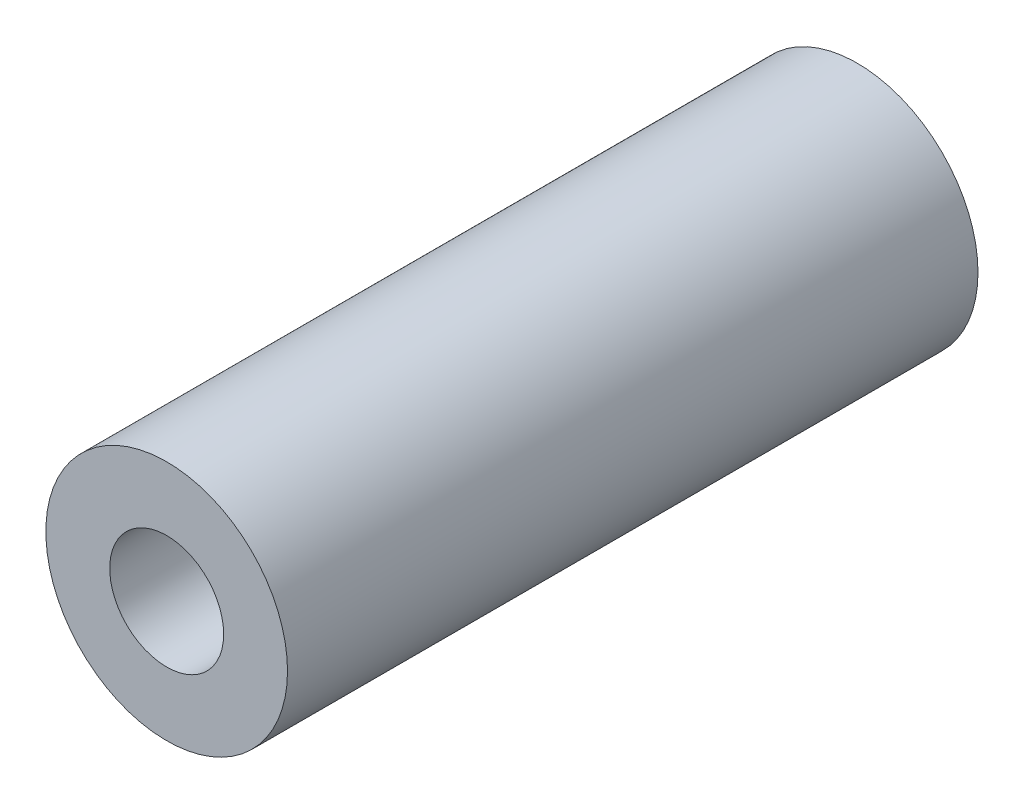
ISO-10303-21;
HEADER;
FILE_DESCRIPTION(('STEP AP214'),'2;1');
FILE_NAME('part.step','',(''),(''),'','','');
FILE_SCHEMA(('AUTOMOTIVE_DESIGN { 1 0 10303 214 1 1 1 1 }'));
ENDSEC;
DATA;
#1=APPLICATION_CONTEXT('core data for automotive mechanical design processes');
#2=APPLICATION_PROTOCOL_DEFINITION('international standard','automotive_design',2000,#1);
#3=PRODUCT_CONTEXT('',#1,'mechanical');
#4=PRODUCT('Part','Part','',(#3));
#5=PRODUCT_RELATED_PRODUCT_CATEGORY('part','',(#4));
#6=PRODUCT_DEFINITION_FORMATION('','',#4);
#7=PRODUCT_DEFINITION_CONTEXT('part definition',#1,'design');
#8=PRODUCT_DEFINITION('design','',#6,#7);
#9=PRODUCT_DEFINITION_SHAPE('','',#8);
#10=(LENGTH_UNIT() NAMED_UNIT(*) SI_UNIT(.MILLI.,.METRE.));
#11=(NAMED_UNIT(*) PLANE_ANGLE_UNIT() SI_UNIT($,.RADIAN.));
#12=(NAMED_UNIT(*) SI_UNIT($,.STERADIAN.) SOLID_ANGLE_UNIT());
#13=UNCERTAINTY_MEASURE_WITH_UNIT(LENGTH_MEASURE(1.E-05),#10,'distance_accuracy_value','');
#14=(GEOMETRIC_REPRESENTATION_CONTEXT(3) GLOBAL_UNCERTAINTY_ASSIGNED_CONTEXT((#13)) GLOBAL_UNIT_ASSIGNED_CONTEXT((#10,
#11,#12)) REPRESENTATION_CONTEXT('',''));
#15=CARTESIAN_POINT('',(0.,0.,0.));
#16=DIRECTION('',(0.,0.,1.));
#17=DIRECTION('',(1.,0.,0.));
#18=AXIS2_PLACEMENT_3D('',#15,#16,#17);
#19=CARTESIAN_POINT('',(0.,0.,20.));
#20=DIRECTION('',(0.,0.,-1.));
#21=DIRECTION('',(-1.,0.,0.));
#22=AXIS2_PLACEMENT_3D('',#19,#20,#21);
#23=CYLINDRICAL_SURFACE('',#22,3.5);
#24=CARTESIAN_POINT('',(0.,0.,20.));
#25=DIRECTION('',(0.,0.,1.));
#26=DIRECTION('',(1.,0.,0.));
#27=AXIS2_PLACEMENT_3D('',#24,#25,#26);
#28=CIRCLE('',#27,3.5);
#29=CARTESIAN_POINT('',(3.5,0.,20.));
#30=VERTEX_POINT('',#29);
#31=EDGE_CURVE('E10',#30,#30,#28,.T.);
#32=ORIENTED_EDGE('',*,*,#31,.F.);
#33=EDGE_LOOP('',(#32));
#34=FACE_BOUND('',#33,.T.);
#35=CARTESIAN_POINT('',(0.,0.,0.));
#36=DIRECTION('',(0.,0.,1.));
#37=DIRECTION('',(1.,0.,0.));
#38=AXIS2_PLACEMENT_3D('',#35,#36,#37);
#39=CIRCLE('',#38,3.5);
#40=CARTESIAN_POINT('',(3.5,0.,0.));
#41=VERTEX_POINT('',#40);
#42=EDGE_CURVE('E46',#41,#41,#39,.T.);
#43=ORIENTED_EDGE('',*,*,#42,.T.);
#44=EDGE_LOOP('',(#43));
#45=FACE_BOUND('',#44,.T.);
#46=ADVANCED_FACE('F43',(#34,#45),#23,.T.);
#47=CARTESIAN_POINT('',(0.,0.,20.));
#48=DIRECTION('',(0.,0.,1.));
#49=DIRECTION('',(1.,0.,0.));
#50=AXIS2_PLACEMENT_3D('',#47,#48,#49);
#51=PLANE('',#50);
#52=CARTESIAN_POINT('',(0.,0.,20.));
#53=DIRECTION('',(0.,0.,1.));
#54=DIRECTION('',(1.,0.,0.));
#55=AXIS2_PLACEMENT_3D('',#52,#53,#54);
#56=CIRCLE('',#55,1.65);
#57=CARTESIAN_POINT('',(1.65,0.,20.));
#58=VERTEX_POINT('',#57);
#59=EDGE_CURVE('E57',#58,#58,#56,.T.);
#60=ORIENTED_EDGE('',*,*,#59,.F.);
#61=EDGE_LOOP('',(#60));
#62=FACE_BOUND('',#61,.T.);
#63=ORIENTED_EDGE('',*,*,#31,.T.);
#64=EDGE_LOOP('',(#63));
#65=FACE_BOUND('',#64,.T.);
#66=ADVANCED_FACE('F63',(#62,#65),#51,.T.);
#67=CARTESIAN_POINT('',(0.,0.,0.));
#68=DIRECTION('',(0.,0.,1.));
#69=DIRECTION('',(1.,0.,0.));
#70=AXIS2_PLACEMENT_3D('',#67,#68,#69);
#71=PLANE('',#70);
#72=CARTESIAN_POINT('',(0.,0.,0.));
#73=DIRECTION('',(0.,0.,1.));
#74=DIRECTION('',(1.,0.,0.));
#75=AXIS2_PLACEMENT_3D('',#72,#73,#74);
#76=CIRCLE('',#75,1.65);
#77=CARTESIAN_POINT('',(1.65,0.,0.));
#78=VERTEX_POINT('',#77);
#79=EDGE_CURVE('E53',#78,#78,#76,.T.);
#80=ORIENTED_EDGE('',*,*,#79,.T.);
#81=EDGE_LOOP('',(#80));
#82=FACE_BOUND('',#81,.T.);
#83=ORIENTED_EDGE('',*,*,#42,.F.);
#84=EDGE_LOOP('',(#83));
#85=FACE_BOUND('',#84,.T.);
#86=ADVANCED_FACE('F65',(#82,#85),#71,.F.);
#87=CARTESIAN_POINT('',(0.,0.,20.));
#88=DIRECTION('',(0.,0.,1.));
#89=DIRECTION('',(1.,0.,0.));
#90=AXIS2_PLACEMENT_3D('',#87,#88,#89);
#91=CYLINDRICAL_SURFACE('',#90,1.65);
#92=ORIENTED_EDGE('',*,*,#79,.F.);
#93=EDGE_LOOP('',(#92));
#94=FACE_BOUND('',#93,.T.);
#95=ORIENTED_EDGE('',*,*,#59,.T.);
#96=EDGE_LOOP('',(#95));
#97=FACE_BOUND('',#96,.T.);
#98=ADVANCED_FACE('F61',(#94,#97),#91,.F.);
#99=CLOSED_SHELL('',(#46,#66,#86,#98));
#100=MANIFOLD_SOLID_BREP('B2',#99);
#101=ADVANCED_BREP_SHAPE_REPRESENTATION('',(#18,#100),#14);
#102=SHAPE_DEFINITION_REPRESENTATION(#9,#101);
ENDSEC;
END-ISO-10303-21;
